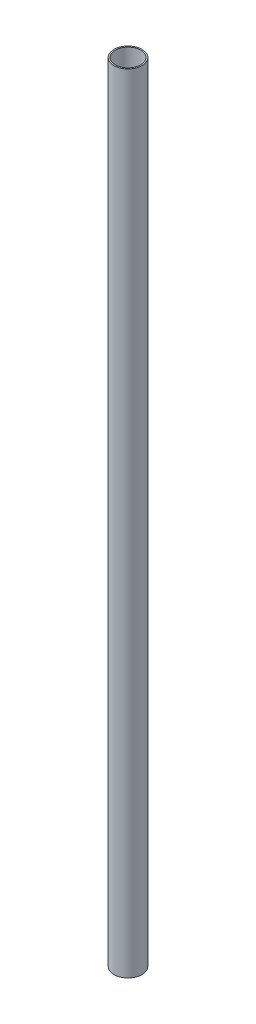
ISO-10303-21;
HEADER;
FILE_DESCRIPTION(('STEP AP214'),'2;1');
FILE_NAME('part.step','',(''),(''),'','','');
FILE_SCHEMA(('AUTOMOTIVE_DESIGN { 1 0 10303 214 1 1 1 1 }'));
ENDSEC;
DATA;
#1=APPLICATION_CONTEXT('core data for automotive mechanical design processes');
#2=APPLICATION_PROTOCOL_DEFINITION('international standard','automotive_design',2000,#1);
#3=PRODUCT_CONTEXT('',#1,'mechanical');
#4=PRODUCT('Part','Part','',(#3));
#5=PRODUCT_RELATED_PRODUCT_CATEGORY('part','',(#4));
#6=PRODUCT_DEFINITION_FORMATION('','',#4);
#7=PRODUCT_DEFINITION_CONTEXT('part definition',#1,'design');
#8=PRODUCT_DEFINITION('design','',#6,#7);
#9=PRODUCT_DEFINITION_SHAPE('','',#8);
#10=(LENGTH_UNIT() NAMED_UNIT(*) SI_UNIT(.MILLI.,.METRE.));
#11=(NAMED_UNIT(*) PLANE_ANGLE_UNIT() SI_UNIT($,.RADIAN.));
#12=(NAMED_UNIT(*) SI_UNIT($,.STERADIAN.) SOLID_ANGLE_UNIT());
#13=UNCERTAINTY_MEASURE_WITH_UNIT(LENGTH_MEASURE(1.E-05),#10,'distance_accuracy_value','');
#14=(GEOMETRIC_REPRESENTATION_CONTEXT(3) GLOBAL_UNCERTAINTY_ASSIGNED_CONTEXT((#13)) GLOBAL_UNIT_ASSIGNED_CONTEXT((#10,
#11,#12)) REPRESENTATION_CONTEXT('',''));
#15=CARTESIAN_POINT('',(0.,0.,0.));
#16=DIRECTION('',(0.,0.,1.));
#17=DIRECTION('',(1.,0.,0.));
#18=AXIS2_PLACEMENT_3D('',#15,#16,#17);
#19=CARTESIAN_POINT('',(0.,533.4,0.));
#20=DIRECTION('',(0.,1.,0.));
#21=DIRECTION('',(0.,0.,1.));
#22=AXIS2_PLACEMENT_3D('',#19,#20,#21);
#23=PLANE('',#22);
#24=CARTESIAN_POINT('',(0.,533.4,0.));
#25=DIRECTION('',(0.,1.,0.));
#26=DIRECTION('',(0.,0.,1.));
#27=AXIS2_PLACEMENT_3D('',#24,#25,#26);
#28=CIRCLE('',#27,9.525);
#29=CARTESIAN_POINT('',(0.,533.4,9.525));
#30=VERTEX_POINT('',#29);
#31=EDGE_CURVE('E10',#30,#30,#28,.T.);
#32=ORIENTED_EDGE('',*,*,#31,.T.);
#33=EDGE_LOOP('',(#32));
#34=FACE_BOUND('',#33,.T.);
#35=CARTESIAN_POINT('',(0.,533.4,0.));
#36=DIRECTION('',(0.,1.,0.));
#37=DIRECTION('',(0.,0.,1.));
#38=AXIS2_PLACEMENT_3D('',#35,#36,#37);
#39=CIRCLE('',#38,8.636);
#40=CARTESIAN_POINT('',(0.,533.4,8.636));
#41=VERTEX_POINT('',#40);
#42=EDGE_CURVE('E39',#41,#41,#39,.F.);
#43=ORIENTED_EDGE('',*,*,#42,.T.);
#44=EDGE_LOOP('',(#43));
#45=FACE_BOUND('',#44,.T.);
#46=ADVANCED_FACE('F28',(#34,#45),#23,.T.);
#47=CARTESIAN_POINT('',(0.,0.,0.));
#48=DIRECTION('',(0.,1.,0.));
#49=DIRECTION('',(0.,0.,1.));
#50=AXIS2_PLACEMENT_3D('',#47,#48,#49);
#51=PLANE('',#50);
#52=CARTESIAN_POINT('',(0.,0.,0.));
#53=DIRECTION('',(0.,1.,0.));
#54=DIRECTION('',(0.,0.,1.));
#55=AXIS2_PLACEMENT_3D('',#52,#53,#54);
#56=CIRCLE('',#55,9.525);
#57=CARTESIAN_POINT('',(0.,0.,9.525));
#58=VERTEX_POINT('',#57);
#59=EDGE_CURVE('E32',#58,#58,#56,.T.);
#60=ORIENTED_EDGE('',*,*,#59,.F.);
#61=EDGE_LOOP('',(#60));
#62=FACE_BOUND('',#61,.T.);
#63=CARTESIAN_POINT('',(0.,0.,0.));
#64=DIRECTION('',(0.,1.,0.));
#65=DIRECTION('',(0.,0.,1.));
#66=AXIS2_PLACEMENT_3D('',#63,#64,#65);
#67=CIRCLE('',#66,8.636);
#68=CARTESIAN_POINT('',(0.,0.,8.636));
#69=VERTEX_POINT('',#68);
#70=EDGE_CURVE('E43',#69,#69,#67,.T.);
#71=ORIENTED_EDGE('',*,*,#70,.T.);
#72=EDGE_LOOP('',(#71));
#73=FACE_BOUND('',#72,.T.);
#74=ADVANCED_FACE('F47',(#62,#73),#51,.F.);
#75=CARTESIAN_POINT('',(0.,533.4,0.));
#76=DIRECTION('',(0.,-1.,0.));
#77=DIRECTION('',(0.,0.,-1.));
#78=AXIS2_PLACEMENT_3D('',#75,#76,#77);
#79=CYLINDRICAL_SURFACE('',#78,9.525);
#80=ORIENTED_EDGE('',*,*,#31,.F.);
#81=EDGE_LOOP('',(#80));
#82=FACE_BOUND('',#81,.T.);
#83=ORIENTED_EDGE('',*,*,#59,.T.);
#84=EDGE_LOOP('',(#83));
#85=FACE_BOUND('',#84,.T.);
#86=ADVANCED_FACE('F30',(#82,#85),#79,.T.);
#87=CARTESIAN_POINT('',(0.,1016.,0.));
#88=DIRECTION('',(0.,-1.,0.));
#89=DIRECTION('',(0.,0.,-1.));
#90=AXIS2_PLACEMENT_3D('',#87,#88,#89);
#91=CYLINDRICAL_SURFACE('',#90,8.636);
#92=ORIENTED_EDGE('',*,*,#42,.F.);
#93=EDGE_LOOP('',(#92));
#94=FACE_BOUND('',#93,.T.);
#95=ORIENTED_EDGE('',*,*,#70,.F.);
#96=EDGE_LOOP('',(#95));
#97=FACE_BOUND('',#96,.T.);
#98=ADVANCED_FACE('F49',(#94,#97),#91,.F.);
#99=CLOSED_SHELL('',(#46,#74,#86,#98));
#100=MANIFOLD_SOLID_BREP('B2',#99);
#101=ADVANCED_BREP_SHAPE_REPRESENTATION('',(#18,#100),#14);
#102=SHAPE_DEFINITION_REPRESENTATION(#9,#101);
ENDSEC;
END-ISO-10303-21;
